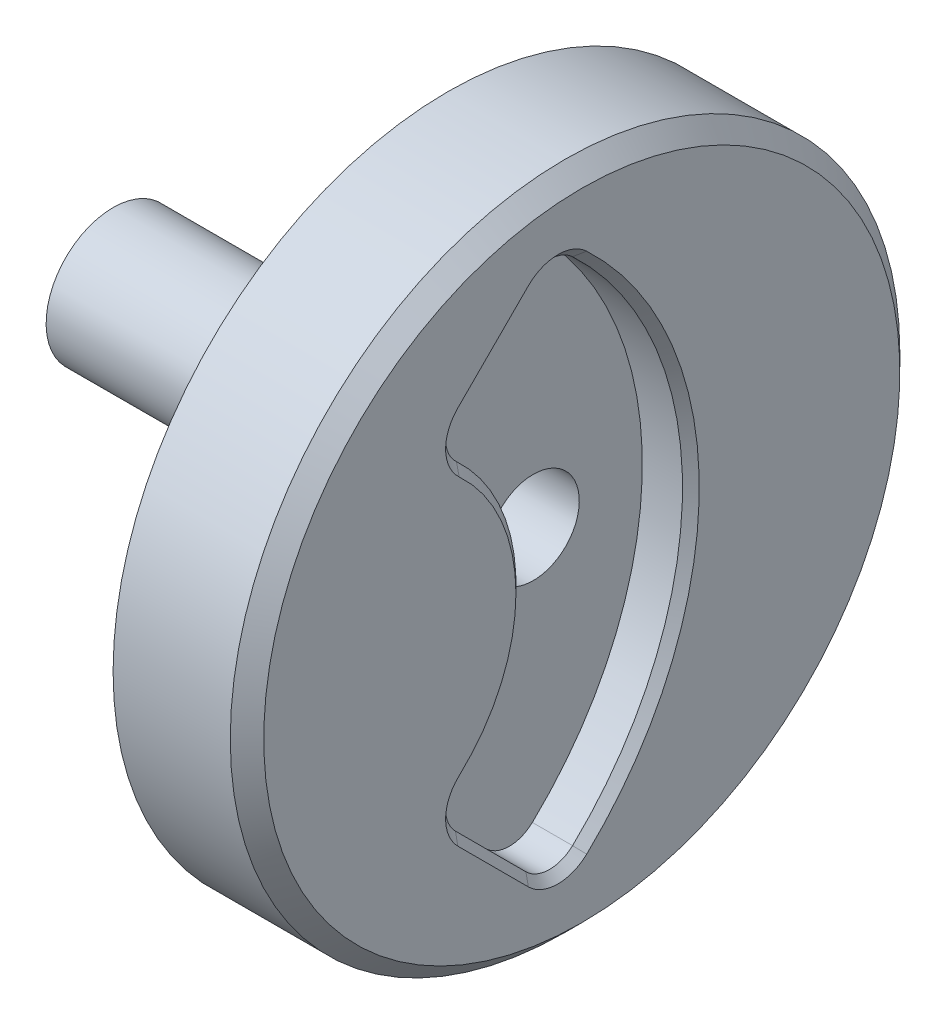
ISO-10303-21;
HEADER;
FILE_DESCRIPTION(('STEP AP214'),'2;1');
FILE_NAME('part.step','',(''),(''),'','','');
FILE_SCHEMA(('AUTOMOTIVE_DESIGN { 1 0 10303 214 1 1 1 1 }'));
ENDSEC;
DATA;
#1=APPLICATION_CONTEXT('core data for automotive mechanical design processes');
#2=APPLICATION_PROTOCOL_DEFINITION('international standard','automotive_design',2000,#1);
#3=PRODUCT_CONTEXT('',#1,'mechanical');
#4=PRODUCT('Part','Part','',(#3));
#5=PRODUCT_RELATED_PRODUCT_CATEGORY('part','',(#4));
#6=PRODUCT_DEFINITION_FORMATION('','',#4);
#7=PRODUCT_DEFINITION_CONTEXT('part definition',#1,'design');
#8=PRODUCT_DEFINITION('design','',#6,#7);
#9=PRODUCT_DEFINITION_SHAPE('','',#8);
#10=(LENGTH_UNIT() NAMED_UNIT(*) SI_UNIT(.MILLI.,.METRE.));
#11=(NAMED_UNIT(*) PLANE_ANGLE_UNIT() SI_UNIT($,.RADIAN.));
#12=(NAMED_UNIT(*) SI_UNIT($,.STERADIAN.) SOLID_ANGLE_UNIT());
#13=UNCERTAINTY_MEASURE_WITH_UNIT(LENGTH_MEASURE(1.E-05),#10,'distance_accuracy_value','');
#14=(GEOMETRIC_REPRESENTATION_CONTEXT(3) GLOBAL_UNCERTAINTY_ASSIGNED_CONTEXT((#13)) GLOBAL_UNIT_ASSIGNED_CONTEXT((#10,
#11,#12)) REPRESENTATION_CONTEXT('',''));
#15=CARTESIAN_POINT('',(0.,0.,0.));
#16=DIRECTION('',(0.,0.,1.));
#17=DIRECTION('',(1.,0.,0.));
#18=AXIS2_PLACEMENT_3D('',#15,#16,#17);
#19=CARTESIAN_POINT('',(-20.,0.,0.));
#20=DIRECTION('',(-1.,0.,0.));
#21=DIRECTION('',(0.,-1.,0.));
#22=AXIS2_PLACEMENT_3D('',#19,#20,#21);
#23=PLANE('',#22);
#24=CARTESIAN_POINT('',(-20.,0.,0.));
#25=DIRECTION('',(-1.,0.,0.));
#26=DIRECTION('',(0.,-1.,0.));
#27=AXIS2_PLACEMENT_3D('',#24,#25,#26);
#28=CIRCLE('',#27,1.75);
#29=CARTESIAN_POINT('',(-20.,-1.75,0.));
#30=VERTEX_POINT('',#29);
#31=EDGE_CURVE('E162',#30,#30,#28,.T.);
#32=ORIENTED_EDGE('',*,*,#31,.F.);
#33=EDGE_LOOP('',(#32));
#34=FACE_BOUND('',#33,.T.);
#35=CARTESIAN_POINT('',(-20.,0.,0.));
#36=DIRECTION('',(1.,0.,0.));
#37=DIRECTION('',(0.,1.,0.));
#38=AXIS2_PLACEMENT_3D('',#35,#36,#37);
#39=CIRCLE('',#38,4.);
#40=CARTESIAN_POINT('',(-20.,4.,0.));
#41=VERTEX_POINT('',#40);
#42=EDGE_CURVE('E217',#41,#41,#39,.T.);
#43=ORIENTED_EDGE('',*,*,#42,.F.);
#44=EDGE_LOOP('',(#43));
#45=FACE_BOUND('',#44,.T.);
#46=ADVANCED_FACE('F47',(#34,#45),#23,.T.);
#47=CARTESIAN_POINT('',(8.,0.,0.));
#48=DIRECTION('',(1.,0.,0.));
#49=DIRECTION('',(0.,1.,0.));
#50=AXIS2_PLACEMENT_3D('',#47,#48,#49);
#51=CYLINDRICAL_SURFACE('',#50,4.);
#52=CARTESIAN_POINT('',(-10.,0.,0.));
#53=DIRECTION('',(-1.,0.,0.));
#54=DIRECTION('',(0.,-1.,0.));
#55=AXIS2_PLACEMENT_3D('',#52,#53,#54);
#56=CIRCLE('',#55,4.);
#57=CARTESIAN_POINT('',(-10.,-4.,0.));
#58=VERTEX_POINT('',#57);
#59=EDGE_CURVE('E228',#58,#58,#56,.T.);
#60=ORIENTED_EDGE('',*,*,#59,.T.);
#61=EDGE_LOOP('',(#60));
#62=FACE_BOUND('',#61,.T.);
#63=ORIENTED_EDGE('',*,*,#42,.T.);
#64=EDGE_LOOP('',(#63));
#65=FACE_BOUND('',#64,.T.);
#66=ADVANCED_FACE('F349',(#62,#65),#51,.T.);
#67=CARTESIAN_POINT('',(0.,4.,0.));
#68=DIRECTION('',(-1.,0.,0.));
#69=DIRECTION('',(0.,-1.,0.));
#70=AXIS2_PLACEMENT_3D('',#67,#68,#69);
#71=PLANE('',#70);
#72=CARTESIAN_POINT('',(0.,0.,0.));
#73=DIRECTION('',(-1.,0.,0.));
#74=DIRECTION('',(0.,-1.,0.));
#75=AXIS2_PLACEMENT_3D('',#72,#73,#74);
#76=CIRCLE('',#75,14.);
#77=CARTESIAN_POINT('',(0.,-14.,0.));
#78=VERTEX_POINT('',#77);
#79=EDGE_CURVE('E224',#78,#78,#76,.F.);
#80=ORIENTED_EDGE('',*,*,#79,.T.);
#81=EDGE_LOOP('',(#80));
#82=FACE_BOUND('',#81,.T.);
#83=CARTESIAN_POINT('',(0.,0.,0.));
#84=DIRECTION('',(1.,0.,0.));
#85=DIRECTION('',(0.,1.,0.));
#86=AXIS2_PLACEMENT_3D('',#83,#84,#85);
#87=CIRCLE('',#86,20.);
#88=CARTESIAN_POINT('',(0.,20.,0.));
#89=VERTEX_POINT('',#88);
#90=EDGE_CURVE('E195',#89,#89,#87,.T.);
#91=ORIENTED_EDGE('',*,*,#90,.F.);
#92=EDGE_LOOP('',(#91));
#93=FACE_BOUND('',#92,.T.);
#94=ADVANCED_FACE('F353',(#82,#93),#71,.T.);
#95=CARTESIAN_POINT('',(8.,0.,0.));
#96=DIRECTION('',(1.,0.,0.));
#97=DIRECTION('',(0.,1.,0.));
#98=AXIS2_PLACEMENT_3D('',#95,#96,#97);
#99=CYLINDRICAL_SURFACE('',#98,20.);
#100=CARTESIAN_POINT('',(7.,0.,0.));
#101=DIRECTION('',(1.,0.,0.));
#102=DIRECTION('',(0.,1.,0.));
#103=AXIS2_PLACEMENT_3D('',#100,#101,#102);
#104=CIRCLE('',#103,20.);
#105=CARTESIAN_POINT('',(7.,20.,0.));
#106=VERTEX_POINT('',#105);
#107=EDGE_CURVE('E238',#106,#106,#104,.F.);
#108=ORIENTED_EDGE('',*,*,#107,.T.);
#109=EDGE_LOOP('',(#108));
#110=FACE_BOUND('',#109,.T.);
#111=ORIENTED_EDGE('',*,*,#90,.T.);
#112=EDGE_LOOP('',(#111));
#113=FACE_BOUND('',#112,.T.);
#114=ADVANCED_FACE('F453',(#110,#113),#99,.T.);
#115=CARTESIAN_POINT('',(8.,20.,0.));
#116=DIRECTION('',(1.,0.,0.));
#117=DIRECTION('',(0.,1.,0.));
#118=AXIS2_PLACEMENT_3D('',#115,#116,#117);
#119=PLANE('',#118);
#120=CARTESIAN_POINT('',(8.,-9.57007567656878,5.63481566920882));
#121=DIRECTION('',(1.,0.,0.));
#122=DIRECTION('',(0.,1.,0.));
#123=AXIS2_PLACEMENT_3D('',#120,#121,#122);
#124=CIRCLE('',#123,2.5);
#125=CARTESIAN_POINT('',(8.,-11.3378426295351,7.40258262217519));
#126=VERTEX_POINT('',#125);
#127=CARTESIAN_POINT('',(8.,-7.72967650799785,7.32683543869246));
#128=VERTEX_POINT('',#127);
#129=EDGE_CURVE('E265',#126,#128,#124,.F.);
#130=ORIENTED_EDGE('',*,*,#129,.T.);
#131=CARTESIAN_POINT('',(8.,0.,14.4333184705237));
#132=DIRECTION('',(1.,0.,0.));
#133=DIRECTION('',(0.,1.,0.));
#134=AXIS2_PLACEMENT_3D('',#131,#132,#133);
#135=CIRCLE('',#134,10.5);
#136=CARTESIAN_POINT('',(8.,7.72967650799786,7.32683543869246));
#137=VERTEX_POINT('',#136);
#138=EDGE_CURVE('E269',#128,#137,#135,.T.);
#139=ORIENTED_EDGE('',*,*,#138,.T.);
#140=CARTESIAN_POINT('',(8.,9.57007567656878,5.63481566920882));
#141=DIRECTION('',(1.,0.,0.));
#142=DIRECTION('',(0.,1.,0.));
#143=AXIS2_PLACEMENT_3D('',#140,#141,#142);
#144=CIRCLE('',#143,2.5);
#145=CARTESIAN_POINT('',(8.,11.3378426295351,7.4025826221752));
#146=VERTEX_POINT('',#145);
#147=EDGE_CURVE('E263',#137,#146,#144,.F.);
#148=ORIENTED_EDGE('',*,*,#147,.T.);
#149=DIRECTION('',(0.,0.707106781186549,-0.707106781186546));
#150=VECTOR('',#149,1.);
#151=CARTESIAN_POINT('',(8.,15.547672205377,3.19275304633334));
#152=LINE('',#151,#150);
#153=CARTESIAN_POINT('',(8.,15.547672205377,3.19275304633334));
#154=VERTEX_POINT('',#153);
#155=EDGE_CURVE('E253',#146,#154,#152,.T.);
#156=ORIENTED_EDGE('',*,*,#155,.T.);
#157=CARTESIAN_POINT('',(8.,13.7799052524107,1.42498609336697));
#158=DIRECTION('',(1.,0.,0.));
#159=DIRECTION('',(0.,1.,0.));
#160=AXIS2_PLACEMENT_3D('',#157,#158,#159);
#161=CIRCLE('',#160,2.5);
#162=CARTESIAN_POINT('',(8.,15.5978347052353,-0.291152742669542));
#163=VERTEX_POINT('',#162);
#164=EDGE_CURVE('E248',#154,#163,#161,.F.);
#165=ORIENTED_EDGE('',*,*,#164,.T.);
#166=CARTESIAN_POINT('',(8.,0.,14.4333184705237));
#167=DIRECTION('',(1.,0.,0.));
#168=DIRECTION('',(0.,1.,0.));
#169=AXIS2_PLACEMENT_3D('',#166,#167,#168);
#170=CIRCLE('',#169,21.45);
#171=CARTESIAN_POINT('',(8.00000000000001,-15.5978347052353,-0.29115274266955));
#172=VERTEX_POINT('',#171);
#173=EDGE_CURVE('E246',#163,#172,#170,.F.);
#174=ORIENTED_EDGE('',*,*,#173,.T.);
#175=CARTESIAN_POINT('',(8.,-13.7799052524107,1.42498609336697));
#176=DIRECTION('',(1.,0.,0.));
#177=DIRECTION('',(0.,1.,0.));
#178=AXIS2_PLACEMENT_3D('',#175,#176,#177);
#179=CIRCLE('',#178,2.5);
#180=CARTESIAN_POINT('',(8.00000000000001,-15.547672205377,3.19275304633334));
#181=VERTEX_POINT('',#180);
#182=EDGE_CURVE('E255',#172,#181,#179,.F.);
#183=ORIENTED_EDGE('',*,*,#182,.T.);
#184=DIRECTION('',(0.,0.707106781186549,0.707106781186546));
#185=VECTOR('',#184,1.);
#186=CARTESIAN_POINT('',(8.,-11.3378426295351,7.40258262217519));
#187=LINE('',#186,#185);
#188=EDGE_CURVE('E259',#181,#126,#187,.T.);
#189=ORIENTED_EDGE('',*,*,#188,.T.);
#190=EDGE_LOOP('',(#130,#139,#148,#156,#165,#174,#183,#189));
#191=FACE_BOUND('',#190,.T.);
#192=CARTESIAN_POINT('',(8.,0.,0.));
#193=DIRECTION('',(1.,0.,0.));
#194=DIRECTION('',(0.,1.,0.));
#195=AXIS2_PLACEMENT_3D('',#192,#193,#194);
#196=CIRCLE('',#195,19.);
#197=CARTESIAN_POINT('',(8.,19.,0.));
#198=VERTEX_POINT('',#197);
#199=EDGE_CURVE('E229',#198,#198,#196,.T.);
#200=ORIENTED_EDGE('',*,*,#199,.T.);
#201=EDGE_LOOP('',(#200));
#202=FACE_BOUND('',#201,.T.);
#203=ADVANCED_FACE('F425',(#191,#202),#119,.T.);
#204=CARTESIAN_POINT('',(5.1,-13.7799052524107,1.42498609336697));
#205=DIRECTION('',(1.,0.,0.));
#206=DIRECTION('',(0.,1.,0.));
#207=AXIS2_PLACEMENT_3D('',#204,#205,#206);
#208=CYLINDRICAL_SURFACE('',#207,2.);
#209=DIRECTION('',(1.,0.,0.));
#210=VECTOR('',#209,1.);
#211=CARTESIAN_POINT('',(5.1,-15.1941188147837,2.83919965574006));
#212=LINE('',#211,#210);
#213=CARTESIAN_POINT('',(5.1,-15.1941188147837,2.83919965574006));
#214=VERTEX_POINT('',#213);
#215=CARTESIAN_POINT('',(7.49999999999999,-15.1941188147837,2.83919965574006));
#216=VERTEX_POINT('',#215);
#217=EDGE_CURVE('E186',#214,#216,#212,.T.);
#218=ORIENTED_EDGE('',*,*,#217,.T.);
#219=CARTESIAN_POINT('',(7.49999999999999,-13.7799052524107,1.42498609336697));
#220=DIRECTION('',(1.,0.,0.));
#221=DIRECTION('',(0.,0.,-1.));
#222=AXIS2_PLACEMENT_3D('',#219,#220,#221);
#223=CIRCLE('',#222,2.);
#224=CARTESIAN_POINT('',(7.49999999999999,-15.2342488146703,0.0520750245377542));
#225=VERTEX_POINT('',#224);
#226=EDGE_CURVE('E71',#216,#225,#223,.T.);
#227=ORIENTED_EDGE('',*,*,#226,.T.);
#228=DIRECTION('',(1.,0.,0.));
#229=VECTOR('',#228,1.);
#230=CARTESIAN_POINT('',(5.1,-15.2342488146703,0.0520750245377542));
#231=LINE('',#230,#229);
#232=CARTESIAN_POINT('',(5.1,-15.2342488146703,0.0520750245377542));
#233=VERTEX_POINT('',#232);
#234=EDGE_CURVE('E136',#233,#225,#231,.T.);
#235=ORIENTED_EDGE('',*,*,#234,.F.);
#236=CARTESIAN_POINT('',(5.1,-13.7799052524107,1.42498609336697));
#237=DIRECTION('',(1.,0.,0.));
#238=DIRECTION('',(0.,-1.,0.));
#239=AXIS2_PLACEMENT_3D('',#236,#237,#238);
#240=CIRCLE('',#239,2.);
#241=EDGE_CURVE('E141',#214,#233,#240,.T.);
#242=ORIENTED_EDGE('',*,*,#241,.F.);
#243=EDGE_LOOP('',(#218,#227,#235,#242));
#244=FACE_BOUND('',#243,.T.);
#245=ADVANCED_FACE('F142',(#244),#208,.F.);
#246=CARTESIAN_POINT('',(5.1,-10.9842892389419,7.04902923158192));
#247=DIRECTION('',(0.,-0.707106781186546,0.707106781186549));
#248=DIRECTION('',(0.,-0.707106781186549,-0.707106781186546));
#249=AXIS2_PLACEMENT_3D('',#246,#247,#248);
#250=PLANE('',#249);
#251=DIRECTION('',(1.,0.,0.));
#252=VECTOR('',#251,1.);
#253=CARTESIAN_POINT('',(5.1,-10.9842892389419,7.04902923158192));
#254=LINE('',#253,#252);
#255=CARTESIAN_POINT('',(5.1,-10.9842892389419,7.04902923158192));
#256=VERTEX_POINT('',#255);
#257=CARTESIAN_POINT('',(7.49999999999999,-10.9842892389419,7.04902923158192));
#258=VERTEX_POINT('',#257);
#259=EDGE_CURVE('E194',#256,#258,#254,.T.);
#260=ORIENTED_EDGE('',*,*,#259,.T.);
#261=DIRECTION('',(0.,-0.707106781186549,-0.707106781186546));
#262=VECTOR('',#261,1.);
#263=CARTESIAN_POINT('',(7.49999999999999,-15.1941188147837,2.83919965574006));
#264=LINE('',#263,#262);
#265=EDGE_CURVE('E280',#258,#216,#264,.T.);
#266=ORIENTED_EDGE('',*,*,#265,.T.);
#267=ORIENTED_EDGE('',*,*,#217,.F.);
#268=DIRECTION('',(0.,-0.707106781186549,-0.707106781186546));
#269=VECTOR('',#268,1.);
#270=CARTESIAN_POINT('',(5.1,-10.9842892389419,7.04902923158192));
#271=LINE('',#270,#269);
#272=EDGE_CURVE('E150',#256,#214,#271,.T.);
#273=ORIENTED_EDGE('',*,*,#272,.F.);
#274=EDGE_LOOP('',(#260,#266,#267,#273));
#275=FACE_BOUND('',#274,.T.);
#276=ADVANCED_FACE('F455',(#275),#250,.F.);
#277=CARTESIAN_POINT('',(5.1,-9.57007567656878,5.63481566920882));
#278=DIRECTION('',(1.,0.,0.));
#279=DIRECTION('',(0.,1.,0.));
#280=AXIS2_PLACEMENT_3D('',#277,#278,#279);
#281=CYLINDRICAL_SURFACE('',#280,2.);
#282=DIRECTION('',(1.,0.,0.));
#283=VECTOR('',#282,1.);
#284=CARTESIAN_POINT('',(5.1,-8.09775634171204,6.98843148479573));
#285=LINE('',#284,#283);
#286=CARTESIAN_POINT('',(5.1,-8.09775634171204,6.98843148479573));
#287=VERTEX_POINT('',#286);
#288=CARTESIAN_POINT('',(7.49999999999999,-8.09775634171204,6.98843148479573));
#289=VERTEX_POINT('',#288);
#290=EDGE_CURVE('E199',#287,#289,#285,.T.);
#291=ORIENTED_EDGE('',*,*,#290,.T.);
#292=CARTESIAN_POINT('',(7.49999999999999,-9.57007567656878,5.63481566920882));
#293=DIRECTION('',(1.,0.,0.));
#294=DIRECTION('',(0.,0.,-1.));
#295=AXIS2_PLACEMENT_3D('',#292,#293,#294);
#296=CIRCLE('',#295,2.);
#297=EDGE_CURVE('E272',#289,#258,#296,.T.);
#298=ORIENTED_EDGE('',*,*,#297,.T.);
#299=ORIENTED_EDGE('',*,*,#259,.F.);
#300=CARTESIAN_POINT('',(5.1,-9.57007567656878,5.63481566920882));
#301=DIRECTION('',(1.,0.,0.));
#302=DIRECTION('',(0.,1.,0.));
#303=AXIS2_PLACEMENT_3D('',#300,#301,#302);
#304=CIRCLE('',#303,2.);
#305=EDGE_CURVE('E183',#287,#256,#304,.T.);
#306=ORIENTED_EDGE('',*,*,#305,.F.);
#307=EDGE_LOOP('',(#291,#298,#299,#306));
#308=FACE_BOUND('',#307,.T.);
#309=ADVANCED_FACE('F570',(#308),#281,.F.);
#310=CARTESIAN_POINT('',(5.1,0.,14.4333184705237));
#311=DIRECTION('',(1.,0.,0.));
#312=DIRECTION('',(0.,1.,0.));
#313=AXIS2_PLACEMENT_3D('',#310,#311,#312);
#314=CYLINDRICAL_SURFACE('',#313,11.);
#315=DIRECTION('',(1.,0.,0.));
#316=VECTOR('',#315,1.);
#317=CARTESIAN_POINT('',(5.1,8.09775634171204,6.98843148479573));
#318=LINE('',#317,#316);
#319=CARTESIAN_POINT('',(5.1,8.09775634171204,6.98843148479573));
#320=VERTEX_POINT('',#319);
#321=CARTESIAN_POINT('',(7.49999999999999,8.09775634171204,6.98843148479573));
#322=VERTEX_POINT('',#321);
#323=EDGE_CURVE('E202',#320,#322,#318,.T.);
#324=ORIENTED_EDGE('',*,*,#323,.T.);
#325=CARTESIAN_POINT('',(7.49999999999999,0.,14.4333184705237));
#326=DIRECTION('',(1.,0.,0.));
#327=DIRECTION('',(0.,1.,0.));
#328=AXIS2_PLACEMENT_3D('',#325,#326,#327);
#329=CIRCLE('',#328,11.);
#330=EDGE_CURVE('E245',#322,#289,#329,.F.);
#331=ORIENTED_EDGE('',*,*,#330,.T.);
#332=ORIENTED_EDGE('',*,*,#290,.F.);
#333=CARTESIAN_POINT('',(5.1,0.,14.4333184705237));
#334=DIRECTION('',(-1.,0.,0.));
#335=DIRECTION('',(0.,-1.,0.));
#336=AXIS2_PLACEMENT_3D('',#333,#334,#335);
#337=CIRCLE('',#336,11.);
#338=EDGE_CURVE('E179',#320,#287,#337,.T.);
#339=ORIENTED_EDGE('',*,*,#338,.F.);
#340=EDGE_LOOP('',(#324,#331,#332,#339));
#341=FACE_BOUND('',#340,.T.);
#342=ADVANCED_FACE('F577',(#341),#314,.T.);
#343=CARTESIAN_POINT('',(5.1,9.57007567656878,5.63481566920882));
#344=DIRECTION('',(1.,0.,0.));
#345=DIRECTION('',(0.,1.,0.));
#346=AXIS2_PLACEMENT_3D('',#343,#344,#345);
#347=CYLINDRICAL_SURFACE('',#346,2.);
#348=DIRECTION('',(1.,0.,0.));
#349=VECTOR('',#348,1.);
#350=CARTESIAN_POINT('',(5.1,10.9842892389419,7.04902923158192));
#351=LINE('',#350,#349);
#352=CARTESIAN_POINT('',(5.1,10.9842892389419,7.04902923158192));
#353=VERTEX_POINT('',#352);
#354=CARTESIAN_POINT('',(7.49999999999999,10.9842892389419,7.04902923158192));
#355=VERTEX_POINT('',#354);
#356=EDGE_CURVE('E203',#353,#355,#351,.T.);
#357=ORIENTED_EDGE('',*,*,#356,.T.);
#358=CARTESIAN_POINT('',(7.49999999999999,9.57007567656878,5.63481566920882));
#359=DIRECTION('',(1.,0.,0.));
#360=DIRECTION('',(0.,0.,-1.));
#361=AXIS2_PLACEMENT_3D('',#358,#359,#360);
#362=CIRCLE('',#361,2.);
#363=EDGE_CURVE('E274',#355,#322,#362,.T.);
#364=ORIENTED_EDGE('',*,*,#363,.T.);
#365=ORIENTED_EDGE('',*,*,#323,.F.);
#366=CARTESIAN_POINT('',(5.1,9.57007567656878,5.63481566920882));
#367=DIRECTION('',(1.,0.,0.));
#368=DIRECTION('',(0.,-1.,0.));
#369=AXIS2_PLACEMENT_3D('',#366,#367,#368);
#370=CIRCLE('',#369,2.);
#371=EDGE_CURVE('E176',#353,#320,#370,.T.);
#372=ORIENTED_EDGE('',*,*,#371,.F.);
#373=EDGE_LOOP('',(#357,#364,#365,#372));
#374=FACE_BOUND('',#373,.T.);
#375=ADVANCED_FACE('F440',(#374),#347,.F.);
#376=CARTESIAN_POINT('',(5.1,15.1941188147837,2.83919965574006));
#377=DIRECTION('',(0.,0.707106781186546,0.707106781186549));
#378=DIRECTION('',(0.,-0.707106781186549,0.707106781186546));
#379=AXIS2_PLACEMENT_3D('',#376,#377,#378);
#380=PLANE('',#379);
#381=DIRECTION('',(1.,0.,0.));
#382=VECTOR('',#381,1.);
#383=CARTESIAN_POINT('',(5.1,15.1941188147837,2.83919965574006));
#384=LINE('',#383,#382);
#385=CARTESIAN_POINT('',(5.1,15.1941188147837,2.83919965574006));
#386=VERTEX_POINT('',#385);
#387=CARTESIAN_POINT('',(7.49999999999999,15.1941188147837,2.83919965574006));
#388=VERTEX_POINT('',#387);
#389=EDGE_CURVE('E209',#386,#388,#384,.T.);
#390=ORIENTED_EDGE('',*,*,#389,.T.);
#391=DIRECTION('',(0.,-0.707106781186549,0.707106781186546));
#392=VECTOR('',#391,1.);
#393=CARTESIAN_POINT('',(7.49999999999999,10.9842892389419,7.04902923158192));
#394=LINE('',#393,#392);
#395=EDGE_CURVE('E278',#388,#355,#394,.T.);
#396=ORIENTED_EDGE('',*,*,#395,.T.);
#397=ORIENTED_EDGE('',*,*,#356,.F.);
#398=DIRECTION('',(0.,-0.707106781186549,0.707106781186546));
#399=VECTOR('',#398,1.);
#400=CARTESIAN_POINT('',(5.1,15.1941188147837,2.83919965574006));
#401=LINE('',#400,#399);
#402=EDGE_CURVE('E175',#386,#353,#401,.T.);
#403=ORIENTED_EDGE('',*,*,#402,.F.);
#404=EDGE_LOOP('',(#390,#396,#397,#403));
#405=FACE_BOUND('',#404,.T.);
#406=ADVANCED_FACE('F433',(#405),#380,.F.);
#407=CARTESIAN_POINT('',(5.1,13.7799052524107,1.42498609336697));
#408=DIRECTION('',(1.,0.,0.));
#409=DIRECTION('',(0.,1.,0.));
#410=AXIS2_PLACEMENT_3D('',#407,#408,#409);
#411=CYLINDRICAL_SURFACE('',#410,2.);
#412=DIRECTION('',(1.,0.,0.));
#413=VECTOR('',#412,1.);
#414=CARTESIAN_POINT('',(5.1,15.2342488146704,0.0520750245377594));
#415=LINE('',#414,#413);
#416=CARTESIAN_POINT('',(5.1,15.2342488146704,0.0520750245377594));
#417=VERTEX_POINT('',#416);
#418=CARTESIAN_POINT('',(7.49999999999999,15.2342488146704,0.0520750245377594));
#419=VERTEX_POINT('',#418);
#420=EDGE_CURVE('E147',#417,#419,#415,.T.);
#421=ORIENTED_EDGE('',*,*,#420,.T.);
#422=CARTESIAN_POINT('',(7.49999999999999,13.7799052524107,1.42498609336697));
#423=DIRECTION('',(1.,0.,0.));
#424=DIRECTION('',(0.,0.,-1.));
#425=AXIS2_PLACEMENT_3D('',#422,#423,#424);
#426=CIRCLE('',#425,2.);
#427=EDGE_CURVE('E58',#419,#388,#426,.T.);
#428=ORIENTED_EDGE('',*,*,#427,.T.);
#429=ORIENTED_EDGE('',*,*,#389,.F.);
#430=CARTESIAN_POINT('',(5.1,13.7799052524107,1.42498609336697));
#431=DIRECTION('',(1.,0.,0.));
#432=DIRECTION('',(0.,1.,0.));
#433=AXIS2_PLACEMENT_3D('',#430,#431,#432);
#434=CIRCLE('',#433,2.);
#435=EDGE_CURVE('E157',#417,#386,#434,.T.);
#436=ORIENTED_EDGE('',*,*,#435,.F.);
#437=EDGE_LOOP('',(#421,#428,#429,#436));
#438=FACE_BOUND('',#437,.T.);
#439=ADVANCED_FACE('F439',(#438),#411,.F.);
#440=CARTESIAN_POINT('',(5.1,0.,14.4333184705237));
#441=DIRECTION('',(1.,0.,0.));
#442=DIRECTION('',(0.,1.,0.));
#443=AXIS2_PLACEMENT_3D('',#440,#441,#442);
#444=CYLINDRICAL_SURFACE('',#443,20.95);
#445=ORIENTED_EDGE('',*,*,#234,.T.);
#446=CARTESIAN_POINT('',(7.49999999999999,0.,14.4333184705237));
#447=DIRECTION('',(1.,0.,0.));
#448=DIRECTION('',(0.,1.,0.));
#449=AXIS2_PLACEMENT_3D('',#446,#447,#448);
#450=CIRCLE('',#449,20.95);
#451=EDGE_CURVE('E12',#225,#419,#450,.T.);
#452=ORIENTED_EDGE('',*,*,#451,.T.);
#453=ORIENTED_EDGE('',*,*,#420,.F.);
#454=CARTESIAN_POINT('',(5.1,0.,14.4333184705237));
#455=DIRECTION('',(1.,0.,0.));
#456=DIRECTION('',(0.,-1.,0.));
#457=AXIS2_PLACEMENT_3D('',#454,#455,#456);
#458=CIRCLE('',#457,20.95);
#459=EDGE_CURVE('E148',#233,#417,#458,.T.);
#460=ORIENTED_EDGE('',*,*,#459,.F.);
#461=EDGE_LOOP('',(#445,#452,#453,#460));
#462=FACE_BOUND('',#461,.T.);
#463=ADVANCED_FACE('F153',(#462),#444,.F.);
#464=CARTESIAN_POINT('',(5.1,-13.7799052524107,1.42498609336697));
#465=DIRECTION('',(-1.,0.,0.));
#466=DIRECTION('',(0.,-1.,0.));
#467=AXIS2_PLACEMENT_3D('',#464,#465,#466);
#468=PLANE('',#467);
#469=CARTESIAN_POINT('',(5.1,0.,0.));
#470=DIRECTION('',(1.,0.,0.));
#471=DIRECTION('',(0.,1.,0.));
#472=AXIS2_PLACEMENT_3D('',#469,#470,#471);
#473=CIRCLE('',#472,2.75);
#474=CARTESIAN_POINT('',(5.1,2.75,0.));
#475=VERTEX_POINT('',#474);
#476=EDGE_CURVE('E317',#475,#475,#473,.T.);
#477=ORIENTED_EDGE('',*,*,#476,.F.);
#478=EDGE_LOOP('',(#477));
#479=FACE_BOUND('',#478,.T.);
#480=ORIENTED_EDGE('',*,*,#241,.T.);
#481=ORIENTED_EDGE('',*,*,#459,.T.);
#482=ORIENTED_EDGE('',*,*,#435,.T.);
#483=ORIENTED_EDGE('',*,*,#402,.T.);
#484=ORIENTED_EDGE('',*,*,#371,.T.);
#485=ORIENTED_EDGE('',*,*,#338,.T.);
#486=ORIENTED_EDGE('',*,*,#305,.T.);
#487=ORIENTED_EDGE('',*,*,#272,.T.);
#488=EDGE_LOOP('',(#480,#481,#482,#483,#484,#485,#486,#487));
#489=FACE_BOUND('',#488,.T.);
#490=ADVANCED_FACE('F160',(#479,#489),#468,.F.);
#491=CARTESIAN_POINT('',(-10.,0.,0.));
#492=DIRECTION('',(-1.,0.,0.));
#493=DIRECTION('',(0.,-1.,0.));
#494=AXIS2_PLACEMENT_3D('',#491,#492,#493);
#495=TOROIDAL_SURFACE('',#494,14.,10.);
#496=ORIENTED_EDGE('',*,*,#59,.F.);
#497=EDGE_LOOP('',(#496));
#498=FACE_BOUND('',#497,.T.);
#499=ORIENTED_EDGE('',*,*,#79,.F.);
#500=EDGE_LOOP('',(#499));
#501=FACE_BOUND('',#500,.T.);
#502=ADVANCED_FACE('F365',(#498,#501),#495,.F.);
#503=CARTESIAN_POINT('',(8.00100000000001,0.,0.));
#504=DIRECTION('',(-1.,0.,0.));
#505=DIRECTION('',(0.,-1.,0.));
#506=AXIS2_PLACEMENT_3D('',#503,#504,#505);
#507=CYLINDRICAL_SURFACE('',#506,1.75);
#508=CARTESIAN_POINT('',(-17.,0.,0.));
#509=DIRECTION('',(-1.,0.,0.));
#510=DIRECTION('',(0.,-1.,0.));
#511=AXIS2_PLACEMENT_3D('',#508,#509,#510);
#512=CIRCLE('',#511,1.75);
#513=CARTESIAN_POINT('',(-17.,-1.75,0.));
#514=VERTEX_POINT('',#513);
#515=EDGE_CURVE('E168',#514,#514,#512,.F.);
#516=ORIENTED_EDGE('',*,*,#515,.T.);
#517=EDGE_LOOP('',(#516));
#518=FACE_BOUND('',#517,.T.);
#519=ORIENTED_EDGE('',*,*,#31,.T.);
#520=EDGE_LOOP('',(#519));
#521=FACE_BOUND('',#520,.T.);
#522=ADVANCED_FACE('F341',(#518,#521),#507,.F.);
#523=CARTESIAN_POINT('',(-17.,0.,0.));
#524=DIRECTION('',(-1.,0.,0.));
#525=DIRECTION('',(0.,-1.,0.));
#526=AXIS2_PLACEMENT_3D('',#523,#524,#525);
#527=PLANE('',#526);
#528=CARTESIAN_POINT('',(-17.,0.,0.));
#529=DIRECTION('',(-1.,0.,0.));
#530=DIRECTION('',(0.,-1.,0.));
#531=AXIS2_PLACEMENT_3D('',#528,#529,#530);
#532=CIRCLE('',#531,2.75);
#533=CARTESIAN_POINT('',(-17.,-2.75,0.));
#534=VERTEX_POINT('',#533);
#535=EDGE_CURVE('E234',#534,#534,#532,.F.);
#536=ORIENTED_EDGE('',*,*,#535,.T.);
#537=EDGE_LOOP('',(#536));
#538=FACE_BOUND('',#537,.T.);
#539=ORIENTED_EDGE('',*,*,#515,.F.);
#540=EDGE_LOOP('',(#539));
#541=FACE_BOUND('',#540,.T.);
#542=ADVANCED_FACE('F326',(#538,#541),#527,.F.);
#543=CARTESIAN_POINT('',(-27.778174593052,0.,0.));
#544=DIRECTION('',(1.,0.,0.));
#545=DIRECTION('',(0.,1.,0.));
#546=AXIS2_PLACEMENT_3D('',#543,#544,#545);
#547=CYLINDRICAL_SURFACE('',#546,2.75);
#548=ORIENTED_EDGE('',*,*,#476,.T.);
#549=EDGE_LOOP('',(#548));
#550=FACE_BOUND('',#549,.T.);
#551=ORIENTED_EDGE('',*,*,#535,.F.);
#552=EDGE_LOOP('',(#551));
#553=FACE_BOUND('',#552,.T.);
#554=ADVANCED_FACE('F335',(#550,#553),#547,.F.);
#555=CARTESIAN_POINT('',(8.,0.,0.));
#556=DIRECTION('',(-1.,0.,0.));
#557=DIRECTION('',(0.,-1.,0.));
#558=AXIS2_PLACEMENT_3D('',#555,#556,#557);
#559=CONICAL_SURFACE('',#558,19.,0.785398163397449);
#560=ORIENTED_EDGE('',*,*,#107,.F.);
#561=EDGE_LOOP('',(#560));
#562=FACE_BOUND('',#561,.T.);
#563=ORIENTED_EDGE('',*,*,#199,.F.);
#564=EDGE_LOOP('',(#563));
#565=FACE_BOUND('',#564,.T.);
#566=ADVANCED_FACE('F333',(#562,#565),#559,.T.);
#567=CARTESIAN_POINT('',(7.49999999999999,0.,14.4333184705237));
#568=DIRECTION('',(1.,0.,0.));
#569=DIRECTION('',(0.,1.,0.));
#570=AXIS2_PLACEMENT_3D('',#567,#568,#569);
#571=CONICAL_SURFACE('',#570,20.95,0.785398163397437);
#572=DIRECTION('',(-0.707106781186554,0.514188097524412,0.485397363367598));
#573=VECTOR('',#572,1.);
#574=CARTESIAN_POINT('',(8.00000000000001,-15.5978347052353,-0.29115274266955));
#575=LINE('',#574,#573);
#576=EDGE_CURVE('E308',#172,#225,#575,.T.);
#577=ORIENTED_EDGE('',*,*,#576,.F.);
#578=ORIENTED_EDGE('',*,*,#173,.F.);
#579=DIRECTION('',(0.707106781186554,0.514188097524414,-0.485397363367596));
#580=VECTOR('',#579,1.);
#581=CARTESIAN_POINT('',(7.49999999999999,15.2342488146704,0.05207502453776));
#582=LINE('',#581,#580);
#583=EDGE_CURVE('E53',#419,#163,#582,.T.);
#584=ORIENTED_EDGE('',*,*,#583,.F.);
#585=ORIENTED_EDGE('',*,*,#451,.F.);
#586=EDGE_LOOP('',(#577,#578,#584,#585));
#587=FACE_BOUND('',#586,.T.);
#588=ADVANCED_FACE('F55',(#587),#571,.F.);
#589=CARTESIAN_POINT('',(7.49999999999999,13.7799052524107,1.42498609336697));
#590=DIRECTION('',(1.,0.,0.));
#591=DIRECTION('',(0.,0.,-1.));
#592=AXIS2_PLACEMENT_3D('',#589,#590,#591);
#593=CONICAL_SURFACE('',#592,2.,0.785398163397439);
#594=ORIENTED_EDGE('',*,*,#583,.T.);
#595=ORIENTED_EDGE('',*,*,#164,.F.);
#596=DIRECTION('',(0.707106781186554,0.499999999999995,0.499999999999996));
#597=VECTOR('',#596,1.);
#598=CARTESIAN_POINT('',(7.49999999999999,15.1941188147837,2.83919965574006));
#599=LINE('',#598,#597);
#600=EDGE_CURVE('E304',#388,#154,#599,.T.);
#601=ORIENTED_EDGE('',*,*,#600,.F.);
#602=ORIENTED_EDGE('',*,*,#427,.F.);
#603=EDGE_LOOP('',(#594,#595,#601,#602));
#604=FACE_BOUND('',#603,.T.);
#605=ADVANCED_FACE('F406',(#604),#593,.F.);
#606=CARTESIAN_POINT('',(7.49999999999999,-13.7799052524107,1.42498609336697));
#607=DIRECTION('',(1.,0.,0.));
#608=DIRECTION('',(0.,0.,-1.));
#609=AXIS2_PLACEMENT_3D('',#606,#607,#608);
#610=CONICAL_SURFACE('',#609,2.,0.785398163397439);
#611=ORIENTED_EDGE('',*,*,#576,.T.);
#612=ORIENTED_EDGE('',*,*,#226,.F.);
#613=DIRECTION('',(-0.707106781186554,0.499999999999996,-0.499999999999995));
#614=VECTOR('',#613,1.);
#615=CARTESIAN_POINT('',(8.00000000000001,-15.547672205377,3.19275304633334));
#616=LINE('',#615,#614);
#617=EDGE_CURVE('E301',#181,#216,#616,.T.);
#618=ORIENTED_EDGE('',*,*,#617,.F.);
#619=ORIENTED_EDGE('',*,*,#182,.F.);
#620=EDGE_LOOP('',(#611,#612,#618,#619));
#621=FACE_BOUND('',#620,.T.);
#622=ADVANCED_FACE('F401',(#621),#610,.F.);
#623=CARTESIAN_POINT('',(7.49999999999999,15.1941188147837,2.83919965574006));
#624=DIRECTION('',(0.707106781186541,-0.500000000000004,-0.500000000000006));
#625=DIRECTION('',(0.,0.707106781186549,-0.707106781186546));
#626=AXIS2_PLACEMENT_3D('',#623,#624,#625);
#627=PLANE('',#626);
#628=ORIENTED_EDGE('',*,*,#600,.T.);
#629=ORIENTED_EDGE('',*,*,#155,.F.);
#630=DIRECTION('',(0.707106781186555,0.499999999999994,0.499999999999995));
#631=VECTOR('',#630,1.);
#632=CARTESIAN_POINT('',(7.49999999999999,10.9842892389419,7.04902923158192));
#633=LINE('',#632,#631);
#634=EDGE_CURVE('E300',#355,#146,#633,.T.);
#635=ORIENTED_EDGE('',*,*,#634,.F.);
#636=ORIENTED_EDGE('',*,*,#395,.F.);
#637=EDGE_LOOP('',(#628,#629,#635,#636));
#638=FACE_BOUND('',#637,.T.);
#639=ADVANCED_FACE('F397',(#638),#627,.T.);
#640=CARTESIAN_POINT('',(7.49999999999999,-10.9842892389419,7.04902923158192));
#641=DIRECTION('',(0.707106781186538,0.500000000000006,-0.500000000000008));
#642=DIRECTION('',(0.,0.707106781186549,0.707106781186546));
#643=AXIS2_PLACEMENT_3D('',#640,#641,#642);
#644=PLANE('',#643);
#645=ORIENTED_EDGE('',*,*,#617,.T.);
#646=ORIENTED_EDGE('',*,*,#265,.F.);
#647=DIRECTION('',(-0.707106781186557,0.499999999999993,-0.499999999999994));
#648=VECTOR('',#647,1.);
#649=CARTESIAN_POINT('',(8.,-11.3378426295351,7.40258262217519));
#650=LINE('',#649,#648);
#651=EDGE_CURVE('E291',#126,#258,#650,.T.);
#652=ORIENTED_EDGE('',*,*,#651,.F.);
#653=ORIENTED_EDGE('',*,*,#188,.F.);
#654=EDGE_LOOP('',(#645,#646,#652,#653));
#655=FACE_BOUND('',#654,.T.);
#656=ADVANCED_FACE('F386',(#655),#644,.T.);
#657=CARTESIAN_POINT('',(7.49999999999999,9.57007567656878,5.63481566920882));
#658=DIRECTION('',(1.,0.,0.));
#659=DIRECTION('',(0.,0.,-1.));
#660=AXIS2_PLACEMENT_3D('',#657,#658,#659);
#661=CONICAL_SURFACE('',#660,2.,0.785398163397437);
#662=ORIENTED_EDGE('',*,*,#634,.T.);
#663=ORIENTED_EDGE('',*,*,#147,.F.);
#664=DIRECTION('',(0.707106781186555,-0.520543492874627,0.478575461161426));
#665=VECTOR('',#664,1.);
#666=CARTESIAN_POINT('',(7.49999999999999,8.09775634171204,6.98843148479573));
#667=LINE('',#666,#665);
#668=EDGE_CURVE('E288',#322,#137,#667,.T.);
#669=ORIENTED_EDGE('',*,*,#668,.F.);
#670=ORIENTED_EDGE('',*,*,#363,.F.);
#671=EDGE_LOOP('',(#662,#663,#669,#670));
#672=FACE_BOUND('',#671,.T.);
#673=ADVANCED_FACE('F385',(#672),#661,.F.);
#674=CARTESIAN_POINT('',(7.49999999999999,-9.57007567656878,5.63481566920882));
#675=DIRECTION('',(1.,0.,0.));
#676=DIRECTION('',(0.,0.,-1.));
#677=AXIS2_PLACEMENT_3D('',#674,#675,#676);
#678=CONICAL_SURFACE('',#677,2.,0.785398163397438);
#679=ORIENTED_EDGE('',*,*,#651,.T.);
#680=ORIENTED_EDGE('',*,*,#297,.F.);
#681=DIRECTION('',(-0.707106781186554,-0.520543492874626,-0.478575461161428));
#682=VECTOR('',#681,1.);
#683=CARTESIAN_POINT('',(8.,-7.72967650799785,7.32683543869246));
#684=LINE('',#683,#682);
#685=EDGE_CURVE('E289',#128,#289,#684,.T.);
#686=ORIENTED_EDGE('',*,*,#685,.F.);
#687=ORIENTED_EDGE('',*,*,#129,.F.);
#688=EDGE_LOOP('',(#679,#680,#686,#687));
#689=FACE_BOUND('',#688,.T.);
#690=ADVANCED_FACE('F374',(#689),#678,.F.);
#691=CARTESIAN_POINT('',(7.49999999999999,0.,14.4333184705237));
#692=DIRECTION('',(-1.,0.,0.));
#693=DIRECTION('',(0.,-1.,0.));
#694=AXIS2_PLACEMENT_3D('',#691,#692,#693);
#695=CONICAL_SURFACE('',#694,11.,0.785398163397437);
#696=ORIENTED_EDGE('',*,*,#668,.T.);
#697=ORIENTED_EDGE('',*,*,#138,.F.);
#698=ORIENTED_EDGE('',*,*,#685,.T.);
#699=ORIENTED_EDGE('',*,*,#330,.F.);
#700=EDGE_LOOP('',(#696,#697,#698,#699));
#701=FACE_BOUND('',#700,.T.);
#702=ADVANCED_FACE('F367',(#701),#695,.T.);
#703=CLOSED_SHELL('',(#46,#66,#94,#114,#203,#245,#276,#309,#342,#375,#406,#439,#463,#490,#502,
#522,#542,#554,#566,#588,#605,#622,#639,#656,#673,#690,#702));
#704=MANIFOLD_SOLID_BREP('B2',#703);
#705=ADVANCED_BREP_SHAPE_REPRESENTATION('',(#18,#704),#14);
#706=SHAPE_DEFINITION_REPRESENTATION(#9,#705);
ENDSEC;
END-ISO-10303-21;
